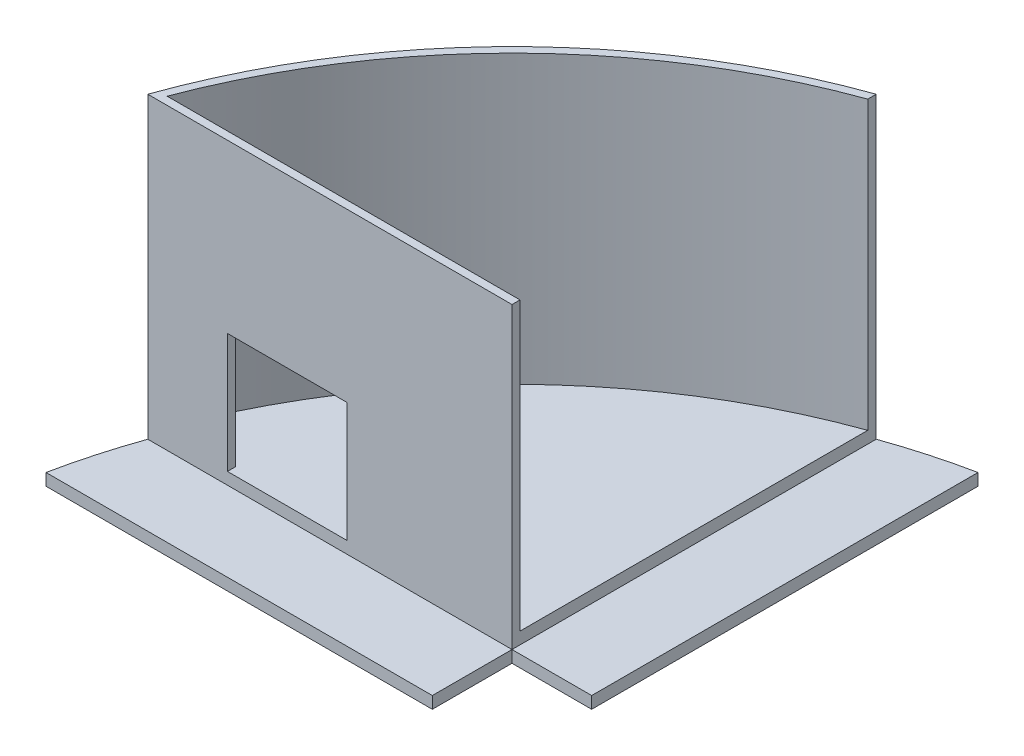
ISO-10303-21;
HEADER;
FILE_DESCRIPTION(('STEP AP214'),'2;1');
FILE_NAME('part.step','',(''),(''),'','','');
FILE_SCHEMA(('AUTOMOTIVE_DESIGN { 1 0 10303 214 1 1 1 1 }'));
ENDSEC;
DATA;
#1=APPLICATION_CONTEXT('core data for automotive mechanical design processes');
#2=APPLICATION_PROTOCOL_DEFINITION('international standard','automotive_design',2000,#1);
#3=PRODUCT_CONTEXT('',#1,'mechanical');
#4=PRODUCT('Part','Part','',(#3));
#5=PRODUCT_RELATED_PRODUCT_CATEGORY('part','',(#4));
#6=PRODUCT_DEFINITION_FORMATION('','',#4);
#7=PRODUCT_DEFINITION_CONTEXT('part definition',#1,'design');
#8=PRODUCT_DEFINITION('design','',#6,#7);
#9=PRODUCT_DEFINITION_SHAPE('','',#8);
#10=(LENGTH_UNIT() NAMED_UNIT(*) SI_UNIT(.MILLI.,.METRE.));
#11=(NAMED_UNIT(*) PLANE_ANGLE_UNIT() SI_UNIT($,.RADIAN.));
#12=(NAMED_UNIT(*) SI_UNIT($,.STERADIAN.) SOLID_ANGLE_UNIT());
#13=UNCERTAINTY_MEASURE_WITH_UNIT(LENGTH_MEASURE(1.E-05),#10,'distance_accuracy_value','');
#14=(GEOMETRIC_REPRESENTATION_CONTEXT(3) GLOBAL_UNCERTAINTY_ASSIGNED_CONTEXT((#13)) GLOBAL_UNIT_ASSIGNED_CONTEXT((#10,
#11,#12)) REPRESENTATION_CONTEXT('',''));
#15=CARTESIAN_POINT('',(0.,0.,0.));
#16=DIRECTION('',(0.,0.,1.));
#17=DIRECTION('',(1.,0.,0.));
#18=AXIS2_PLACEMENT_3D('',#15,#16,#17);
#19=CARTESIAN_POINT('',(0.,3.,0.));
#20=DIRECTION('',(0.,-1.,0.));
#21=DIRECTION('',(0.,0.,-1.));
#22=AXIS2_PLACEMENT_3D('',#19,#20,#21);
#23=CYLINDRICAL_SURFACE('',#22,148.);
#24=DIRECTION('',(0.,-1.,0.));
#25=VECTOR('',#24,1.);
#26=CARTESIAN_POINT('',(-138.56406460551,76.,-52.));
#27=LINE('',#26,#25);
#28=CARTESIAN_POINT('',(-138.56406460551,78.,-52.));
#29=VERTEX_POINT('',#28);
#30=CARTESIAN_POINT('',(-138.56406460551,6.00000000000001,-52.));
#31=VERTEX_POINT('',#30);
#32=EDGE_CURVE('E188',#29,#31,#27,.T.);
#33=ORIENTED_EDGE('',*,*,#32,.T.);
#34=CARTESIAN_POINT('',(8.32667268468867E-13,6.,8.18789480661053E-13));
#35=DIRECTION('',(0.,-1.,0.));
#36=DIRECTION('',(0.,0.,-1.));
#37=AXIS2_PLACEMENT_3D('',#34,#35,#36);
#38=CIRCLE('',#37,148.000000000001);
#39=CARTESIAN_POINT('',(-50.,6.,-139.298241194927));
#40=VERTEX_POINT('',#39);
#41=EDGE_CURVE('E176',#31,#40,#38,.T.);
#42=ORIENTED_EDGE('',*,*,#41,.T.);
#43=DIRECTION('',(0.,-1.,0.));
#44=VECTOR('',#43,1.);
#45=CARTESIAN_POINT('',(-50.,76.,-139.298241194927));
#46=LINE('',#45,#44);
#47=CARTESIAN_POINT('',(-50.,78.,-139.298241194927));
#48=VERTEX_POINT('',#47);
#49=EDGE_CURVE('E191',#48,#40,#46,.T.);
#50=ORIENTED_EDGE('',*,*,#49,.F.);
#51=CARTESIAN_POINT('',(-2.35922392732846E-13,78.,-2.63677968348475E-13));
#52=DIRECTION('',(0.,1.,0.));
#53=DIRECTION('',(0.,0.,1.));
#54=AXIS2_PLACEMENT_3D('',#51,#52,#53);
#55=CIRCLE('',#54,148.);
#56=EDGE_CURVE('E181',#48,#29,#55,.T.);
#57=ORIENTED_EDGE('',*,*,#56,.T.);
#58=EDGE_LOOP('',(#33,#42,#50,#57));
#59=FACE_BOUND('',#58,.T.);
#60=ADVANCED_FACE('F34',(#59),#23,.F.);
#61=CARTESIAN_POINT('',(-50.,78.,-52.));
#62=DIRECTION('',(0.,0.,-1.));
#63=DIRECTION('',(-1.,0.,0.));
#64=AXIS2_PLACEMENT_3D('',#61,#62,#63);
#65=PLANE('',#64);
#66=DIRECTION('',(0.,1.,0.));
#67=VECTOR('',#66,1.);
#68=CARTESIAN_POINT('',(-91.4213562373095,-51.6176843138221,-52.));
#69=LINE('',#68,#67);
#70=CARTESIAN_POINT('',(-91.4213562373095,6.,-52.));
#71=VERTEX_POINT('',#70);
#72=CARTESIAN_POINT('',(-91.4213562373095,36.,-52.));
#73=VERTEX_POINT('',#72);
#74=EDGE_CURVE('E57',#71,#73,#69,.T.);
#75=ORIENTED_EDGE('',*,*,#74,.T.);
#76=DIRECTION('',(-1.,0.,0.));
#77=VECTOR('',#76,1.);
#78=CARTESIAN_POINT('',(-95.7106781186548,36.,-52.));
#79=LINE('',#78,#77);
#80=CARTESIAN_POINT('',(-121.42135623731,36.,-52.));
#81=VERTEX_POINT('',#80);
#82=EDGE_CURVE('E146',#73,#81,#79,.T.);
#83=ORIENTED_EDGE('',*,*,#82,.T.);
#84=DIRECTION('',(0.,-1.,0.));
#85=VECTOR('',#84,1.);
#86=CARTESIAN_POINT('',(-121.42135623731,-51.6176843138221,-52.));
#87=LINE('',#86,#85);
#88=CARTESIAN_POINT('',(-121.42135623731,6.00000000000001,-52.));
#89=VERTEX_POINT('',#88);
#90=EDGE_CURVE('E143',#81,#89,#87,.T.);
#91=ORIENTED_EDGE('',*,*,#90,.T.);
#92=DIRECTION('',(-1.,0.,0.));
#93=VECTOR('',#92,1.);
#94=CARTESIAN_POINT('',(-88.4846922834953,6.,-52.));
#95=LINE('',#94,#93);
#96=EDGE_CURVE('E171',#89,#31,#95,.T.);
#97=ORIENTED_EDGE('',*,*,#96,.T.);
#98=ORIENTED_EDGE('',*,*,#32,.F.);
#99=DIRECTION('',(1.,0.,0.));
#100=VECTOR('',#99,1.);
#101=CARTESIAN_POINT('',(-196.415591335933,78.,-52.));
#102=LINE('',#101,#100);
#103=CARTESIAN_POINT('',(-50.,78.,-52.));
#104=VERTEX_POINT('',#103);
#105=EDGE_CURVE('E184',#29,#104,#102,.T.);
#106=ORIENTED_EDGE('',*,*,#105,.T.);
#107=DIRECTION('',(0.,-1.,0.));
#108=VECTOR('',#107,1.);
#109=CARTESIAN_POINT('',(-50.,78.,-52.));
#110=LINE('',#109,#108);
#111=CARTESIAN_POINT('',(-50.,6.,-52.));
#112=VERTEX_POINT('',#111);
#113=EDGE_CURVE('E187',#104,#112,#110,.T.);
#114=ORIENTED_EDGE('',*,*,#113,.T.);
#115=EDGE_CURVE('E156',#112,#71,#95,.T.);
#116=ORIENTED_EDGE('',*,*,#115,.T.);
#117=EDGE_LOOP('',(#75,#83,#91,#97,#98,#106,#114,#116));
#118=FACE_BOUND('',#117,.T.);
#119=ADVANCED_FACE('F153',(#118),#65,.T.);
#120=CARTESIAN_POINT('',(-217.292436663422,3.,-88.4846922834953));
#121=DIRECTION('',(0.,1.,0.));
#122=DIRECTION('',(0.,0.,1.));
#123=AXIS2_PLACEMENT_3D('',#120,#121,#122);
#124=PLANE('',#123);
#125=DIRECTION('',(0.,0.,-1.));
#126=VECTOR('',#125,1.);
#127=CARTESIAN_POINT('',(-50.,3.,-50.));
#128=LINE('',#127,#126);
#129=CARTESIAN_POINT('',(-50.,3.,-50.));
#130=VERTEX_POINT('',#129);
#131=CARTESIAN_POINT('',(-50.,3.,-141.42135623731));
#132=VERTEX_POINT('',#131);
#133=EDGE_CURVE('E38',#130,#132,#128,.T.);
#134=ORIENTED_EDGE('',*,*,#133,.F.);
#135=DIRECTION('',(-1.,0.,0.));
#136=VECTOR('',#135,1.);
#137=CARTESIAN_POINT('',(-217.292436663422,3.,-50.));
#138=LINE('',#137,#136);
#139=CARTESIAN_POINT('',(-30.,3.,-50.));
#140=VERTEX_POINT('',#139);
#141=EDGE_CURVE('E213',#140,#130,#138,.T.);
#142=ORIENTED_EDGE('',*,*,#141,.F.);
#143=DIRECTION('',(0.,0.,-1.));
#144=VECTOR('',#143,1.);
#145=CARTESIAN_POINT('',(-30.,3.,-88.4846922834953));
#146=LINE('',#145,#144);
#147=CARTESIAN_POINT('',(-30.,3.,-146.969384566991));
#148=VERTEX_POINT('',#147);
#149=EDGE_CURVE('E216',#140,#148,#146,.T.);
#150=ORIENTED_EDGE('',*,*,#149,.T.);
#151=CARTESIAN_POINT('',(0.,3.,0.));
#152=DIRECTION('',(0.,1.,0.));
#153=DIRECTION('',(0.,0.,1.));
#154=AXIS2_PLACEMENT_3D('',#151,#152,#153);
#155=CIRCLE('',#154,150.);
#156=EDGE_CURVE('E227',#148,#132,#155,.T.);
#157=ORIENTED_EDGE('',*,*,#156,.T.);
#158=EDGE_LOOP('',(#134,#142,#150,#157));
#159=FACE_BOUND('',#158,.T.);
#160=ADVANCED_FACE('F277',(#159),#124,.T.);
#161=CARTESIAN_POINT('',(-50.,3.,-88.4846922834953));
#162=DIRECTION('',(-1.,0.,0.));
#163=DIRECTION('',(0.,0.,1.));
#164=AXIS2_PLACEMENT_3D('',#161,#162,#163);
#165=PLANE('',#164);
#166=DIRECTION('',(0.,0.,-1.));
#167=VECTOR('',#166,1.);
#168=CARTESIAN_POINT('',(-50.,0.,-88.4846922834953));
#169=LINE('',#168,#167);
#170=CARTESIAN_POINT('',(-50.,0.,-30.));
#171=VERTEX_POINT('',#170);
#172=CARTESIAN_POINT('',(-50.,0.,-50.));
#173=VERTEX_POINT('',#172);
#174=EDGE_CURVE('E247',#171,#173,#169,.T.);
#175=ORIENTED_EDGE('',*,*,#174,.T.);
#176=DIRECTION('',(0.,-1.,0.));
#177=VECTOR('',#176,1.);
#178=CARTESIAN_POINT('',(-50.,3.,-50.));
#179=LINE('',#178,#177);
#180=EDGE_CURVE('E11',#130,#173,#179,.T.);
#181=ORIENTED_EDGE('',*,*,#180,.F.);
#182=DIRECTION('',(0.,0.,-1.));
#183=VECTOR('',#182,1.);
#184=CARTESIAN_POINT('',(-50.,3.,-88.4846922834953));
#185=LINE('',#184,#183);
#186=CARTESIAN_POINT('',(-50.,3.,-30.));
#187=VERTEX_POINT('',#186);
#188=EDGE_CURVE('E210',#187,#130,#185,.T.);
#189=ORIENTED_EDGE('',*,*,#188,.F.);
#190=DIRECTION('',(0.,-1.,0.));
#191=VECTOR('',#190,1.);
#192=CARTESIAN_POINT('',(-50.,3.,-30.));
#193=LINE('',#192,#191);
#194=EDGE_CURVE('E236',#187,#171,#193,.T.);
#195=ORIENTED_EDGE('',*,*,#194,.T.);
#196=EDGE_LOOP('',(#175,#181,#189,#195));
#197=FACE_BOUND('',#196,.T.);
#198=ADVANCED_FACE('F36',(#197),#165,.F.);
#199=CARTESIAN_POINT('',(-217.292436663422,3.,-50.));
#200=DIRECTION('',(0.,0.,1.));
#201=DIRECTION('',(1.,0.,0.));
#202=AXIS2_PLACEMENT_3D('',#199,#200,#201);
#203=PLANE('',#202);
#204=DIRECTION('',(-1.,0.,0.));
#205=VECTOR('',#204,1.);
#206=CARTESIAN_POINT('',(-217.292436663422,0.,-50.));
#207=LINE('',#206,#205);
#208=CARTESIAN_POINT('',(-30.,0.,-50.));
#209=VERTEX_POINT('',#208);
#210=EDGE_CURVE('E245',#209,#173,#207,.T.);
#211=ORIENTED_EDGE('',*,*,#210,.F.);
#212=DIRECTION('',(0.,-1.,0.));
#213=VECTOR('',#212,1.);
#214=CARTESIAN_POINT('',(-30.,3.,-50.));
#215=LINE('',#214,#213);
#216=EDGE_CURVE('E44',#140,#209,#215,.T.);
#217=ORIENTED_EDGE('',*,*,#216,.F.);
#218=ORIENTED_EDGE('',*,*,#141,.T.);
#219=ORIENTED_EDGE('',*,*,#180,.T.);
#220=EDGE_LOOP('',(#211,#217,#218,#219));
#221=FACE_BOUND('',#220,.T.);
#222=ADVANCED_FACE('F447',(#221),#203,.T.);
#223=CARTESIAN_POINT('',(-30.,3.,-88.4846922834953));
#224=DIRECTION('',(-1.,0.,0.));
#225=DIRECTION('',(0.,0.,1.));
#226=AXIS2_PLACEMENT_3D('',#223,#224,#225);
#227=PLANE('',#226);
#228=DIRECTION('',(0.,0.,-1.));
#229=VECTOR('',#228,1.);
#230=CARTESIAN_POINT('',(-30.,0.,-88.4846922834953));
#231=LINE('',#230,#229);
#232=CARTESIAN_POINT('',(-30.,0.,-146.969384566991));
#233=VERTEX_POINT('',#232);
#234=EDGE_CURVE('E243',#209,#233,#231,.T.);
#235=ORIENTED_EDGE('',*,*,#234,.T.);
#236=DIRECTION('',(0.,-1.,0.));
#237=VECTOR('',#236,1.);
#238=CARTESIAN_POINT('',(-30.,3.,-146.969384566991));
#239=LINE('',#238,#237);
#240=EDGE_CURVE('E231',#148,#233,#239,.T.);
#241=ORIENTED_EDGE('',*,*,#240,.F.);
#242=ORIENTED_EDGE('',*,*,#149,.F.);
#243=ORIENTED_EDGE('',*,*,#216,.T.);
#244=EDGE_LOOP('',(#235,#241,#242,#243));
#245=FACE_BOUND('',#244,.T.);
#246=ADVANCED_FACE('F429',(#245),#227,.F.);
#247=CARTESIAN_POINT('',(0.,3.,0.));
#248=DIRECTION('',(0.,-1.,0.));
#249=DIRECTION('',(0.,0.,-1.));
#250=AXIS2_PLACEMENT_3D('',#247,#248,#249);
#251=CYLINDRICAL_SURFACE('',#250,150.);
#252=CARTESIAN_POINT('',(0.,0.,0.));
#253=DIRECTION('',(0.,1.,0.));
#254=DIRECTION('',(0.,0.,1.));
#255=AXIS2_PLACEMENT_3D('',#252,#253,#254);
#256=CIRCLE('',#255,150.);
#257=CARTESIAN_POINT('',(-146.969384566991,0.,-30.));
#258=VERTEX_POINT('',#257);
#259=EDGE_CURVE('E240',#233,#258,#256,.T.);
#260=ORIENTED_EDGE('',*,*,#259,.T.);
#261=DIRECTION('',(0.,-1.,0.));
#262=VECTOR('',#261,1.);
#263=CARTESIAN_POINT('',(-146.969384566991,3.,-30.));
#264=LINE('',#263,#262);
#265=CARTESIAN_POINT('',(-146.969384566991,3.,-30.));
#266=VERTEX_POINT('',#265);
#267=EDGE_CURVE('E234',#266,#258,#264,.T.);
#268=ORIENTED_EDGE('',*,*,#267,.F.);
#269=CARTESIAN_POINT('',(-141.42135623731,3.,-50.));
#270=VERTEX_POINT('',#269);
#271=EDGE_CURVE('E218',#270,#266,#155,.T.);
#272=ORIENTED_EDGE('',*,*,#271,.F.);
#273=DIRECTION('',(0.,-1.,0.));
#274=VECTOR('',#273,1.);
#275=CARTESIAN_POINT('',(-141.42135623731,78.,-50.));
#276=LINE('',#275,#274);
#277=CARTESIAN_POINT('',(-141.42135623731,78.,-50.));
#278=VERTEX_POINT('',#277);
#279=EDGE_CURVE('E209',#278,#270,#276,.T.);
#280=ORIENTED_EDGE('',*,*,#279,.F.);
#281=CARTESIAN_POINT('',(8.32667268468867E-13,78.,8.32667268468867E-13));
#282=DIRECTION('',(0.,1.,0.));
#283=DIRECTION('',(0.,0.,-1.));
#284=AXIS2_PLACEMENT_3D('',#281,#282,#283);
#285=CIRCLE('',#284,150.000000000001);
#286=CARTESIAN_POINT('',(-50.,78.,-141.42135623731));
#287=VERTEX_POINT('',#286);
#288=EDGE_CURVE('E200',#287,#278,#285,.T.);
#289=ORIENTED_EDGE('',*,*,#288,.F.);
#290=DIRECTION('',(0.,-1.,0.));
#291=VECTOR('',#290,1.);
#292=CARTESIAN_POINT('',(-50.,78.,-141.42135623731));
#293=LINE('',#292,#291);
#294=EDGE_CURVE('E249',#287,#132,#293,.T.);
#295=ORIENTED_EDGE('',*,*,#294,.T.);
#296=ORIENTED_EDGE('',*,*,#156,.F.);
#297=ORIENTED_EDGE('',*,*,#240,.T.);
#298=EDGE_LOOP('',(#260,#268,#272,#280,#289,#295,#296,#297));
#299=FACE_BOUND('',#298,.T.);
#300=ADVANCED_FACE('F280',(#299),#251,.T.);
#301=CARTESIAN_POINT('',(-217.292436663422,3.,-30.));
#302=DIRECTION('',(0.,0.,1.));
#303=DIRECTION('',(1.,0.,0.));
#304=AXIS2_PLACEMENT_3D('',#301,#302,#303);
#305=PLANE('',#304);
#306=DIRECTION('',(-1.,0.,0.));
#307=VECTOR('',#306,1.);
#308=CARTESIAN_POINT('',(-217.292436663422,0.,-30.));
#309=LINE('',#308,#307);
#310=EDGE_CURVE('E214',#171,#258,#309,.T.);
#311=ORIENTED_EDGE('',*,*,#310,.F.);
#312=ORIENTED_EDGE('',*,*,#194,.F.);
#313=DIRECTION('',(-1.,0.,0.));
#314=VECTOR('',#313,1.);
#315=CARTESIAN_POINT('',(-217.292436663422,3.,-30.));
#316=LINE('',#315,#314);
#317=EDGE_CURVE('E221',#187,#266,#316,.T.);
#318=ORIENTED_EDGE('',*,*,#317,.T.);
#319=ORIENTED_EDGE('',*,*,#267,.T.);
#320=EDGE_LOOP('',(#311,#312,#318,#319));
#321=FACE_BOUND('',#320,.T.);
#322=ADVANCED_FACE('F290',(#321),#305,.T.);
#323=DIRECTION('',(1.,0.,0.));
#324=VECTOR('',#323,1.);
#325=CARTESIAN_POINT('',(-50.,3.,-50.));
#326=LINE('',#325,#324);
#327=EDGE_CURVE('E266',#270,#130,#326,.T.);
#328=ORIENTED_EDGE('',*,*,#327,.F.);
#329=ORIENTED_EDGE('',*,*,#271,.T.);
#330=ORIENTED_EDGE('',*,*,#317,.F.);
#331=ORIENTED_EDGE('',*,*,#188,.T.);
#332=EDGE_LOOP('',(#328,#329,#330,#331));
#333=FACE_BOUND('',#332,.T.);
#334=ADVANCED_FACE('F389',(#333),#124,.T.);
#335=CARTESIAN_POINT('',(-217.292436663422,0.,-88.4846922834953));
#336=DIRECTION('',(0.,1.,0.));
#337=DIRECTION('',(0.,0.,1.));
#338=AXIS2_PLACEMENT_3D('',#335,#336,#337);
#339=PLANE('',#338);
#340=ORIENTED_EDGE('',*,*,#174,.F.);
#341=ORIENTED_EDGE('',*,*,#310,.T.);
#342=ORIENTED_EDGE('',*,*,#259,.F.);
#343=ORIENTED_EDGE('',*,*,#234,.F.);
#344=ORIENTED_EDGE('',*,*,#210,.T.);
#345=EDGE_LOOP('',(#340,#341,#342,#343,#344));
#346=FACE_BOUND('',#345,.T.);
#347=ADVANCED_FACE('F286',(#346),#339,.F.);
#348=CARTESIAN_POINT('',(-50.,78.,-50.));
#349=DIRECTION('',(-1.,0.,0.));
#350=DIRECTION('',(0.,0.,1.));
#351=AXIS2_PLACEMENT_3D('',#348,#349,#350);
#352=PLANE('',#351);
#353=DIRECTION('',(0.,0.,-1.));
#354=VECTOR('',#353,1.);
#355=CARTESIAN_POINT('',(-50.,78.,-50.));
#356=LINE('',#355,#354);
#357=EDGE_CURVE('E201',#48,#287,#356,.T.);
#358=ORIENTED_EDGE('',*,*,#357,.F.);
#359=ORIENTED_EDGE('',*,*,#49,.T.);
#360=DIRECTION('',(0.,0.,-1.));
#361=VECTOR('',#360,1.);
#362=CARTESIAN_POINT('',(-50.,6.,-217.292436663422));
#363=LINE('',#362,#361);
#364=EDGE_CURVE('E179',#112,#40,#363,.T.);
#365=ORIENTED_EDGE('',*,*,#364,.F.);
#366=ORIENTED_EDGE('',*,*,#113,.F.);
#367=CARTESIAN_POINT('',(-50.,78.,-50.));
#368=VERTEX_POINT('',#367);
#369=EDGE_CURVE('E197',#368,#104,#356,.T.);
#370=ORIENTED_EDGE('',*,*,#369,.F.);
#371=DIRECTION('',(0.,-1.,0.));
#372=VECTOR('',#371,1.);
#373=CARTESIAN_POINT('',(-50.,78.,-50.));
#374=LINE('',#373,#372);
#375=EDGE_CURVE('E204',#368,#130,#374,.T.);
#376=ORIENTED_EDGE('',*,*,#375,.T.);
#377=ORIENTED_EDGE('',*,*,#133,.T.);
#378=ORIENTED_EDGE('',*,*,#294,.F.);
#379=EDGE_LOOP('',(#358,#359,#365,#366,#370,#376,#377,#378));
#380=FACE_BOUND('',#379,.T.);
#381=ADVANCED_FACE('F273',(#380),#352,.F.);
#382=CARTESIAN_POINT('',(-50.,78.,-50.));
#383=DIRECTION('',(0.,0.,-1.));
#384=DIRECTION('',(-1.,0.,0.));
#385=AXIS2_PLACEMENT_3D('',#382,#383,#384);
#386=PLANE('',#385);
#387=DIRECTION('',(-1.,0.,0.));
#388=VECTOR('',#387,1.);
#389=CARTESIAN_POINT('',(-95.7106781186548,36.,-50.));
#390=LINE('',#389,#388);
#391=CARTESIAN_POINT('',(-91.4213562373095,36.,-50.));
#392=VERTEX_POINT('',#391);
#393=CARTESIAN_POINT('',(-121.42135623731,36.,-50.));
#394=VERTEX_POINT('',#393);
#395=EDGE_CURVE('E165',#392,#394,#390,.T.);
#396=ORIENTED_EDGE('',*,*,#395,.F.);
#397=DIRECTION('',(0.,1.,0.));
#398=VECTOR('',#397,1.);
#399=CARTESIAN_POINT('',(-91.4213562373095,-51.6176843138221,-50.));
#400=LINE('',#399,#398);
#401=CARTESIAN_POINT('',(-91.4213562373095,6.,-50.));
#402=VERTEX_POINT('',#401);
#403=EDGE_CURVE('E52',#402,#392,#400,.T.);
#404=ORIENTED_EDGE('',*,*,#403,.F.);
#405=DIRECTION('',(1.,0.,0.));
#406=VECTOR('',#405,1.);
#407=CARTESIAN_POINT('',(-95.7106781186547,6.,-50.));
#408=LINE('',#407,#406);
#409=CARTESIAN_POINT('',(-121.42135623731,6.00000000000001,-50.));
#410=VERTEX_POINT('',#409);
#411=EDGE_CURVE('E157',#410,#402,#408,.T.);
#412=ORIENTED_EDGE('',*,*,#411,.F.);
#413=DIRECTION('',(0.,-1.,0.));
#414=VECTOR('',#413,1.);
#415=CARTESIAN_POINT('',(-121.42135623731,-51.6176843138221,-50.));
#416=LINE('',#415,#414);
#417=EDGE_CURVE('E160',#394,#410,#416,.T.);
#418=ORIENTED_EDGE('',*,*,#417,.F.);
#419=EDGE_LOOP('',(#396,#404,#412,#418));
#420=FACE_BOUND('',#419,.T.);
#421=ORIENTED_EDGE('',*,*,#327,.T.);
#422=ORIENTED_EDGE('',*,*,#375,.F.);
#423=DIRECTION('',(1.,0.,0.));
#424=VECTOR('',#423,1.);
#425=CARTESIAN_POINT('',(-50.,78.,-50.));
#426=LINE('',#425,#424);
#427=EDGE_CURVE('E203',#278,#368,#426,.T.);
#428=ORIENTED_EDGE('',*,*,#427,.F.);
#429=ORIENTED_EDGE('',*,*,#279,.T.);
#430=EDGE_LOOP('',(#421,#422,#428,#429));
#431=FACE_BOUND('',#430,.T.);
#432=ADVANCED_FACE('F298',(#420,#431),#386,.F.);
#433=CARTESIAN_POINT('',(8.32667268468867E-13,78.,8.32667268468867E-13));
#434=DIRECTION('',(0.,-1.,0.));
#435=DIRECTION('',(0.,0.,-1.));
#436=AXIS2_PLACEMENT_3D('',#433,#434,#435);
#437=PLANE('',#436);
#438=ORIENTED_EDGE('',*,*,#369,.T.);
#439=ORIENTED_EDGE('',*,*,#105,.F.);
#440=ORIENTED_EDGE('',*,*,#56,.F.);
#441=ORIENTED_EDGE('',*,*,#357,.T.);
#442=ORIENTED_EDGE('',*,*,#288,.T.);
#443=ORIENTED_EDGE('',*,*,#427,.T.);
#444=EDGE_LOOP('',(#438,#439,#440,#441,#442,#443));
#445=FACE_BOUND('',#444,.T.);
#446=ADVANCED_FACE('F300',(#445),#437,.F.);
#447=CARTESIAN_POINT('',(-88.4846922834953,6.,-217.292436663422));
#448=DIRECTION('',(0.,-1.,0.));
#449=DIRECTION('',(0.,0.,-1.));
#450=AXIS2_PLACEMENT_3D('',#447,#448,#449);
#451=PLANE('',#450);
#452=ORIENTED_EDGE('',*,*,#115,.F.);
#453=ORIENTED_EDGE('',*,*,#364,.T.);
#454=ORIENTED_EDGE('',*,*,#41,.F.);
#455=ORIENTED_EDGE('',*,*,#96,.F.);
#456=DIRECTION('',(0.,0.,1.));
#457=VECTOR('',#456,1.);
#458=CARTESIAN_POINT('',(-121.42135623731,6.00000000000001,-52.));
#459=LINE('',#458,#457);
#460=EDGE_CURVE('E172',#89,#410,#459,.T.);
#461=ORIENTED_EDGE('',*,*,#460,.T.);
#462=ORIENTED_EDGE('',*,*,#411,.T.);
#463=DIRECTION('',(0.,0.,1.));
#464=VECTOR('',#463,1.);
#465=CARTESIAN_POINT('',(-91.4213562373095,6.,-52.));
#466=LINE('',#465,#464);
#467=EDGE_CURVE('E169',#71,#402,#466,.T.);
#468=ORIENTED_EDGE('',*,*,#467,.F.);
#469=EDGE_LOOP('',(#452,#453,#454,#455,#461,#462,#468));
#470=FACE_BOUND('',#469,.T.);
#471=ADVANCED_FACE('F307',(#470),#451,.F.);
#472=CARTESIAN_POINT('',(-91.4213562373095,-51.6176843138221,-52.));
#473=DIRECTION('',(1.,0.,0.));
#474=DIRECTION('',(0.,1.,0.));
#475=AXIS2_PLACEMENT_3D('',#472,#473,#474);
#476=PLANE('',#475);
#477=ORIENTED_EDGE('',*,*,#403,.T.);
#478=DIRECTION('',(0.,0.,1.));
#479=VECTOR('',#478,1.);
#480=CARTESIAN_POINT('',(-91.4213562373095,36.,-52.));
#481=LINE('',#480,#479);
#482=EDGE_CURVE('E136',#73,#392,#481,.T.);
#483=ORIENTED_EDGE('',*,*,#482,.F.);
#484=ORIENTED_EDGE('',*,*,#74,.F.);
#485=ORIENTED_EDGE('',*,*,#467,.T.);
#486=EDGE_LOOP('',(#477,#483,#484,#485));
#487=FACE_BOUND('',#486,.T.);
#488=ADVANCED_FACE('F138',(#487),#476,.F.);
#489=CARTESIAN_POINT('',(-121.42135623731,-51.6176843138221,-52.));
#490=DIRECTION('',(-1.,0.,0.));
#491=DIRECTION('',(0.,0.,1.));
#492=AXIS2_PLACEMENT_3D('',#489,#490,#491);
#493=PLANE('',#492);
#494=ORIENTED_EDGE('',*,*,#417,.T.);
#495=ORIENTED_EDGE('',*,*,#460,.F.);
#496=ORIENTED_EDGE('',*,*,#90,.F.);
#497=DIRECTION('',(0.,0.,1.));
#498=VECTOR('',#497,1.);
#499=CARTESIAN_POINT('',(-121.42135623731,36.,-52.));
#500=LINE('',#499,#498);
#501=EDGE_CURVE('E142',#81,#394,#500,.T.);
#502=ORIENTED_EDGE('',*,*,#501,.T.);
#503=EDGE_LOOP('',(#494,#495,#496,#502));
#504=FACE_BOUND('',#503,.T.);
#505=ADVANCED_FACE('F309',(#504),#493,.F.);
#506=CARTESIAN_POINT('',(-95.7106781186548,36.,-52.));
#507=DIRECTION('',(0.,1.,0.));
#508=DIRECTION('',(-1.,0.,0.));
#509=AXIS2_PLACEMENT_3D('',#506,#507,#508);
#510=PLANE('',#509);
#511=ORIENTED_EDGE('',*,*,#395,.T.);
#512=ORIENTED_EDGE('',*,*,#501,.F.);
#513=ORIENTED_EDGE('',*,*,#82,.F.);
#514=ORIENTED_EDGE('',*,*,#482,.T.);
#515=EDGE_LOOP('',(#511,#512,#513,#514));
#516=FACE_BOUND('',#515,.T.);
#517=ADVANCED_FACE('F147',(#516),#510,.F.);
#518=CLOSED_SHELL('',(#60,#119,#160,#198,#222,#246,#300,#322,#334,#347,#381,#432,#446,#471,#488,
#505,#517));
#519=MANIFOLD_SOLID_BREP('B2',#518);
#520=ADVANCED_BREP_SHAPE_REPRESENTATION('',(#18,#519),#14);
#521=SHAPE_DEFINITION_REPRESENTATION(#9,#520);
ENDSEC;
END-ISO-10303-21;
